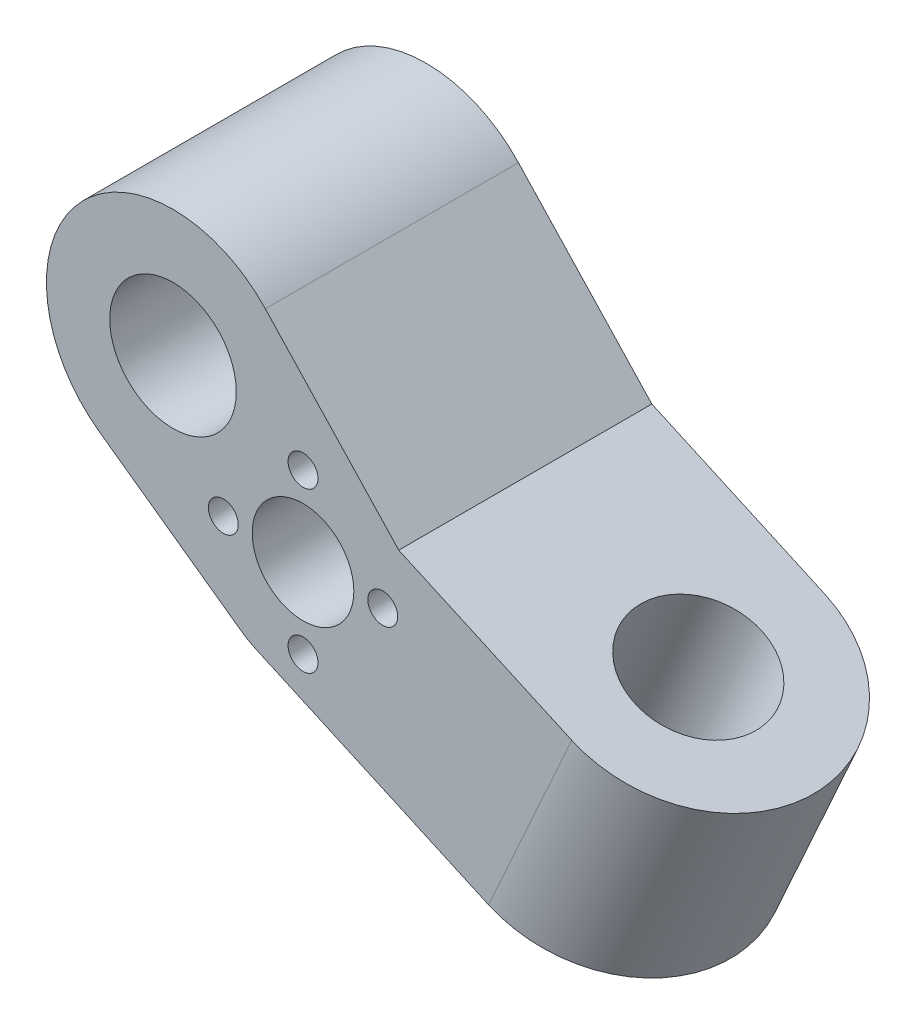
ISO-10303-21;
HEADER;
FILE_DESCRIPTION(('STEP AP214'),'2;1');
FILE_NAME('part.step','',(''),(''),'','','');
FILE_SCHEMA(('AUTOMOTIVE_DESIGN { 1 0 10303 214 1 1 1 1 }'));
ENDSEC;
DATA;
#1=APPLICATION_CONTEXT('core data for automotive mechanical design processes');
#2=APPLICATION_PROTOCOL_DEFINITION('international standard','automotive_design',2000,#1);
#3=PRODUCT_CONTEXT('',#1,'mechanical');
#4=PRODUCT('Part','Part','',(#3));
#5=PRODUCT_RELATED_PRODUCT_CATEGORY('part','',(#4));
#6=PRODUCT_DEFINITION_FORMATION('','',#4);
#7=PRODUCT_DEFINITION_CONTEXT('part definition',#1,'design');
#8=PRODUCT_DEFINITION('design','',#6,#7);
#9=PRODUCT_DEFINITION_SHAPE('','',#8);
#10=(LENGTH_UNIT() NAMED_UNIT(*) SI_UNIT(.MILLI.,.METRE.));
#11=(NAMED_UNIT(*) PLANE_ANGLE_UNIT() SI_UNIT($,.RADIAN.));
#12=(NAMED_UNIT(*) SI_UNIT($,.STERADIAN.) SOLID_ANGLE_UNIT());
#13=UNCERTAINTY_MEASURE_WITH_UNIT(LENGTH_MEASURE(1.E-05),#10,'distance_accuracy_value','');
#14=(GEOMETRIC_REPRESENTATION_CONTEXT(3) GLOBAL_UNCERTAINTY_ASSIGNED_CONTEXT((#13)) GLOBAL_UNIT_ASSIGNED_CONTEXT((#10,
#11,#12)) REPRESENTATION_CONTEXT('',''));
#15=CARTESIAN_POINT('',(0.,0.,0.));
#16=DIRECTION('',(0.,0.,1.));
#17=DIRECTION('',(1.,0.,0.));
#18=AXIS2_PLACEMENT_3D('',#15,#16,#17);
#19=CARTESIAN_POINT('',(-55.498309581815,-77.4958825390944,25.4));
#20=DIRECTION('',(0.582238843982918,0.813017791046073,0.));
#21=DIRECTION('',(-0.813017791046073,0.582238843982918,0.));
#22=AXIS2_PLACEMENT_3D('',#19,#20,#21);
#23=PLANE('',#22);
#24=DIRECTION('',(0.813017791046073,-0.582238843982918,0.));
#25=VECTOR('',#24,1.);
#26=CARTESIAN_POINT('',(-55.498309581815,-77.4958825390944,0.));
#27=LINE('',#26,#25);
#28=CARTESIAN_POINT('',(-95.4426102206748,-48.8899606468416,0.));
#29=VERTEX_POINT('',#28);
#30=CARTESIAN_POINT('',(-81.4046272838121,-58.9431957015068,0.));
#31=VERTEX_POINT('',#30);
#32=EDGE_CURVE('E187',#29,#31,#27,.T.);
#33=ORIENTED_EDGE('',*,*,#32,.T.);
#34=DIRECTION('',(0.,0.,-1.));
#35=VECTOR('',#34,1.);
#36=CARTESIAN_POINT('',(-81.4046272838121,-58.9431957015068,25.4));
#37=LINE('',#36,#35);
#38=CARTESIAN_POINT('',(-81.4046272838121,-58.9431957015068,25.4));
#39=VERTEX_POINT('',#38);
#40=EDGE_CURVE('E12',#39,#31,#37,.T.);
#41=ORIENTED_EDGE('',*,*,#40,.F.);
#42=DIRECTION('',(0.813017791046073,-0.582238843982918,0.));
#43=VECTOR('',#42,1.);
#44=CARTESIAN_POINT('',(-55.498309581815,-77.4958825390944,25.4));
#45=LINE('',#44,#43);
#46=CARTESIAN_POINT('',(-95.4426102206748,-48.8899606468416,25.4));
#47=VERTEX_POINT('',#46);
#48=EDGE_CURVE('E218',#47,#39,#45,.T.);
#49=ORIENTED_EDGE('',*,*,#48,.F.);
#50=DIRECTION('',(0.,0.,-1.));
#51=VECTOR('',#50,1.);
#52=CARTESIAN_POINT('',(-95.4426102206748,-48.8899606468416,25.4));
#53=LINE('',#52,#51);
#54=EDGE_CURVE('E100',#47,#29,#53,.T.);
#55=ORIENTED_EDGE('',*,*,#54,.T.);
#56=EDGE_LOOP('',(#33,#41,#49,#55));
#57=FACE_BOUND('',#56,.T.);
#58=ADVANCED_FACE('F77',(#57),#23,.F.);
#59=CARTESIAN_POINT('',(-75.,-50.,25.4));
#60=DIRECTION('',(0.,0.,-1.));
#61=DIRECTION('',(-1.,0.,0.));
#62=AXIS2_PLACEMENT_3D('',#59,#60,#61);
#63=CYLINDRICAL_SURFACE('',#62,11.);
#64=CARTESIAN_POINT('',(-75.,-50.,0.));
#65=DIRECTION('',(0.,0.,1.));
#66=DIRECTION('',(1.,0.,0.));
#67=AXIS2_PLACEMENT_3D('',#64,#65,#66);
#68=CIRCLE('',#67,11.);
#69=CARTESIAN_POINT('',(-79.5269394944947,-60.0253089136038,0.));
#70=VERTEX_POINT('',#69);
#71=EDGE_CURVE('E189',#31,#70,#68,.T.);
#72=ORIENTED_EDGE('',*,*,#71,.T.);
#73=DIRECTION('',(0.,0.,-1.));
#74=VECTOR('',#73,1.);
#75=CARTESIAN_POINT('',(-79.5269394944947,-60.0253089136038,25.4));
#76=LINE('',#75,#74);
#77=CARTESIAN_POINT('',(-79.5269394944947,-60.0253089136038,25.4));
#78=VERTEX_POINT('',#77);
#79=EDGE_CURVE('E84',#78,#70,#76,.T.);
#80=ORIENTED_EDGE('',*,*,#79,.F.);
#81=CARTESIAN_POINT('',(-75.,-50.,25.4));
#82=DIRECTION('',(0.,0.,1.));
#83=DIRECTION('',(1.,0.,0.));
#84=AXIS2_PLACEMENT_3D('',#81,#82,#83);
#85=CIRCLE('',#84,11.);
#86=EDGE_CURVE('E130',#39,#78,#85,.T.);
#87=ORIENTED_EDGE('',*,*,#86,.F.);
#88=ORIENTED_EDGE('',*,*,#40,.T.);
#89=EDGE_LOOP('',(#72,#80,#87,#88));
#90=FACE_BOUND('',#89,.T.);
#91=ADVANCED_FACE('F226',(#90),#63,.T.);
#92=CARTESIAN_POINT('',(-35.9830298439687,-79.6876101993222,25.4));
#93=DIRECTION('',(-0.411539954044973,-0.911391719418528,0.));
#94=DIRECTION('',(0.911391719418528,-0.411539954044974,0.));
#95=AXIS2_PLACEMENT_3D('',#92,#93,#94);
#96=PLANE('',#95);
#97=CARTESIAN_POINT('',(-56.3775898212641,-70.4784237463461,12.7));
#98=DIRECTION('',(-0.411539954044973,-0.911391719418528,0.));
#99=DIRECTION('',(0.911391719418528,-0.411539954044974,0.));
#100=AXIS2_PLACEMENT_3D('',#97,#98,#99);
#101=CIRCLE('',#100,6.35);
#102=CARTESIAN_POINT('',(-50.5902524029564,-73.0917024545317,12.7));
#103=VERTEX_POINT('',#102);
#104=EDGE_CURVE('E241',#103,#103,#101,.F.);
#105=ORIENTED_EDGE('',*,*,#104,.T.);
#106=EDGE_LOOP('',(#105));
#107=FACE_BOUND('',#106,.T.);
#108=DIRECTION('',(-0.911391719418528,0.411539954044974,0.));
#109=VECTOR('',#108,1.);
#110=CARTESIAN_POINT('',(-35.9830298439687,-79.6876101993222,0.));
#111=LINE('',#110,#109);
#112=CARTESIAN_POINT('',(-56.3775898212641,-70.4784237463461,0.));
#113=VERTEX_POINT('',#112);
#114=EDGE_CURVE('E192',#113,#70,#111,.T.);
#115=ORIENTED_EDGE('',*,*,#114,.F.);
#116=CARTESIAN_POINT('',(-56.3775898212641,-70.4784237463461,12.7));
#117=DIRECTION('',(-0.411539954044973,-0.911391719418528,0.));
#118=DIRECTION('',(0.911391719418528,-0.411539954044974,0.));
#119=AXIS2_PLACEMENT_3D('',#116,#117,#118);
#120=CIRCLE('',#119,12.7);
#121=CARTESIAN_POINT('',(-56.3775898212641,-70.4784237463461,25.4));
#122=VERTEX_POINT('',#121);
#123=EDGE_CURVE('E238',#113,#122,#120,.T.);
#124=ORIENTED_EDGE('',*,*,#123,.T.);
#125=DIRECTION('',(-0.911391719418528,0.411539954044974,0.));
#126=VECTOR('',#125,1.);
#127=CARTESIAN_POINT('',(-35.9830298439687,-79.6876101993222,25.4));
#128=LINE('',#127,#126);
#129=EDGE_CURVE('E163',#122,#78,#128,.T.);
#130=ORIENTED_EDGE('',*,*,#129,.T.);
#131=ORIENTED_EDGE('',*,*,#79,.T.);
#132=EDGE_LOOP('',(#115,#124,#130,#131));
#133=FACE_BOUND('',#132,.T.);
#134=ADVANCED_FACE('F223',(#107,#133),#96,.T.);
#135=CARTESIAN_POINT('',(-27.6395674308052,-61.2102728718123,25.4));
#136=DIRECTION('',(0.411539954044974,0.911391719418528,0.));
#137=DIRECTION('',(-0.911391719418528,0.411539954044974,0.));
#138=AXIS2_PLACEMENT_3D('',#135,#136,#137);
#139=PLANE('',#138);
#140=CARTESIAN_POINT('',(-48.0341274081007,-52.0010864188363,12.7));
#141=DIRECTION('',(0.411539954044974,0.911391719418528,0.));
#142=DIRECTION('',(-0.911391719418528,0.411539954044974,0.));
#143=AXIS2_PLACEMENT_3D('',#140,#141,#142);
#144=CIRCLE('',#143,6.35);
#145=CARTESIAN_POINT('',(-53.8214648264083,-49.3878077106507,12.7));
#146=VERTEX_POINT('',#145);
#147=EDGE_CURVE('E236',#146,#146,#144,.T.);
#148=ORIENTED_EDGE('',*,*,#147,.F.);
#149=EDGE_LOOP('',(#148));
#150=FACE_BOUND('',#149,.T.);
#151=CARTESIAN_POINT('',(-48.0341274081007,-52.0010864188363,12.7));
#152=DIRECTION('',(0.411539954044974,0.911391719418528,0.));
#153=DIRECTION('',(-0.911391719418528,0.411539954044974,0.));
#154=AXIS2_PLACEMENT_3D('',#151,#152,#153);
#155=CIRCLE('',#154,12.7);
#156=CARTESIAN_POINT('',(-48.0341274081007,-52.0010864188363,0.));
#157=VERTEX_POINT('',#156);
#158=CARTESIAN_POINT('',(-48.0341274081006,-52.0010864188362,25.4));
#159=VERTEX_POINT('',#158);
#160=EDGE_CURVE('E91',#157,#159,#155,.F.);
#161=ORIENTED_EDGE('',*,*,#160,.F.);
#162=DIRECTION('',(0.911391719418528,-0.411539954044974,0.));
#163=VECTOR('',#162,1.);
#164=CARTESIAN_POINT('',(-27.6395674308052,-61.2102728718123,0.));
#165=LINE('',#164,#163);
#166=CARTESIAN_POINT('',(-65.3961396630236,-44.1612502942795,0.));
#167=VERTEX_POINT('',#166);
#168=EDGE_CURVE('E146',#167,#157,#165,.T.);
#169=ORIENTED_EDGE('',*,*,#168,.F.);
#170=DIRECTION('',(0.,0.,-1.));
#171=VECTOR('',#170,1.);
#172=CARTESIAN_POINT('',(-65.3961396630236,-44.1612502942795,25.4));
#173=LINE('',#172,#171);
#174=CARTESIAN_POINT('',(-65.3961396630236,-44.1612502942795,25.4));
#175=VERTEX_POINT('',#174);
#176=EDGE_CURVE('E140',#175,#167,#173,.T.);
#177=ORIENTED_EDGE('',*,*,#176,.F.);
#178=DIRECTION('',(0.911391719418528,-0.411539954044974,0.));
#179=VECTOR('',#178,1.);
#180=CARTESIAN_POINT('',(-27.6395674308052,-61.2102728718123,25.4));
#181=LINE('',#180,#179);
#182=EDGE_CURVE('E144',#175,#159,#181,.T.);
#183=ORIENTED_EDGE('',*,*,#182,.T.);
#184=EDGE_LOOP('',(#161,#169,#177,#183));
#185=FACE_BOUND('',#184,.T.);
#186=ADVANCED_FACE('F142',(#150,#185),#139,.T.);
#187=CARTESIAN_POINT('',(-56.8473280884351,-53.2820851007276,25.4));
#188=DIRECTION('',(-0.729615872168891,-0.683857206644215,0.));
#189=DIRECTION('',(0.683857206644215,-0.729615872168891,0.));
#190=AXIS2_PLACEMENT_3D('',#187,#188,#189);
#191=PLANE('',#190);
#192=DIRECTION('',(-0.683857206644215,0.729615872168891,0.));
#193=VECTOR('',#192,1.);
#194=CARTESIAN_POINT('',(-56.8473280884351,-53.2820851007276,0.));
#195=LINE('',#194,#193);
#196=CARTESIAN_POINT('',(-78.7820553255468,-29.8796481761749,0.));
#197=VERTEX_POINT('',#196);
#198=EDGE_CURVE('E195',#167,#197,#195,.T.);
#199=ORIENTED_EDGE('',*,*,#198,.T.);
#200=DIRECTION('',(0.,0.,-1.));
#201=VECTOR('',#200,1.);
#202=CARTESIAN_POINT('',(-78.7820553255468,-29.8796481761749,25.4));
#203=LINE('',#202,#201);
#204=CARTESIAN_POINT('',(-78.7820553255468,-29.8796481761749,25.4));
#205=VERTEX_POINT('',#204);
#206=EDGE_CURVE('E150',#205,#197,#203,.T.);
#207=ORIENTED_EDGE('',*,*,#206,.F.);
#208=DIRECTION('',(-0.683857206644215,0.729615872168891,0.));
#209=VECTOR('',#208,1.);
#210=CARTESIAN_POINT('',(-56.8473280884351,-53.2820851007276,25.4));
#211=LINE('',#210,#209);
#212=EDGE_CURVE('E153',#175,#205,#211,.T.);
#213=ORIENTED_EDGE('',*,*,#212,.F.);
#214=ORIENTED_EDGE('',*,*,#176,.T.);
#215=EDGE_LOOP('',(#199,#207,#213,#214));
#216=FACE_BOUND('',#215,.T.);
#217=ADVANCED_FACE('F154',(#216),#191,.F.);
#218=CARTESIAN_POINT('',(-75.,-58.,25.4));
#219=DIRECTION('',(0.,0.,-1.));
#220=DIRECTION('',(-1.,0.,0.));
#221=AXIS2_PLACEMENT_3D('',#218,#219,#220);
#222=CYLINDRICAL_SURFACE('',#221,1.5);
#223=CARTESIAN_POINT('',(-75.,-58.,25.4));
#224=DIRECTION('',(0.,0.,1.));
#225=DIRECTION('',(1.,0.,0.));
#226=AXIS2_PLACEMENT_3D('',#223,#224,#225);
#227=CIRCLE('',#226,1.5);
#228=CARTESIAN_POINT('',(-73.5,-58.,25.4));
#229=VERTEX_POINT('',#228);
#230=EDGE_CURVE('E181',#229,#229,#227,.T.);
#231=ORIENTED_EDGE('',*,*,#230,.T.);
#232=EDGE_LOOP('',(#231));
#233=FACE_BOUND('',#232,.T.);
#234=CARTESIAN_POINT('',(-75.,-58.,0.));
#235=DIRECTION('',(0.,0.,1.));
#236=DIRECTION('',(1.,0.,0.));
#237=AXIS2_PLACEMENT_3D('',#234,#235,#236);
#238=CIRCLE('',#237,1.5);
#239=CARTESIAN_POINT('',(-73.5,-58.,0.));
#240=VERTEX_POINT('',#239);
#241=EDGE_CURVE('E212',#240,#240,#238,.T.);
#242=ORIENTED_EDGE('',*,*,#241,.F.);
#243=EDGE_LOOP('',(#242));
#244=FACE_BOUND('',#243,.T.);
#245=ADVANCED_FACE('F262',(#233,#244),#222,.F.);
#246=CARTESIAN_POINT('',(-83.,-50.,25.4));
#247=DIRECTION('',(0.,0.,-1.));
#248=DIRECTION('',(-1.,0.,0.));
#249=AXIS2_PLACEMENT_3D('',#246,#247,#248);
#250=CYLINDRICAL_SURFACE('',#249,1.5);
#251=CARTESIAN_POINT('',(-83.,-50.,25.4));
#252=DIRECTION('',(0.,0.,1.));
#253=DIRECTION('',(1.,0.,0.));
#254=AXIS2_PLACEMENT_3D('',#251,#252,#253);
#255=CIRCLE('',#254,1.5);
#256=CARTESIAN_POINT('',(-81.5,-50.,25.4));
#257=VERTEX_POINT('',#256);
#258=EDGE_CURVE('E178',#257,#257,#255,.T.);
#259=ORIENTED_EDGE('',*,*,#258,.T.);
#260=EDGE_LOOP('',(#259));
#261=FACE_BOUND('',#260,.T.);
#262=CARTESIAN_POINT('',(-83.,-50.,0.));
#263=DIRECTION('',(0.,0.,1.));
#264=DIRECTION('',(1.,0.,0.));
#265=AXIS2_PLACEMENT_3D('',#262,#263,#264);
#266=CIRCLE('',#265,1.5);
#267=CARTESIAN_POINT('',(-81.5,-50.,0.));
#268=VERTEX_POINT('',#267);
#269=EDGE_CURVE('E209',#268,#268,#266,.T.);
#270=ORIENTED_EDGE('',*,*,#269,.F.);
#271=EDGE_LOOP('',(#270));
#272=FACE_BOUND('',#271,.T.);
#273=ADVANCED_FACE('F278',(#261,#272),#250,.F.);
#274=CARTESIAN_POINT('',(-67.,-50.,25.4));
#275=DIRECTION('',(0.,0.,-1.));
#276=DIRECTION('',(-1.,0.,0.));
#277=AXIS2_PLACEMENT_3D('',#274,#275,#276);
#278=CYLINDRICAL_SURFACE('',#277,1.5);
#279=CARTESIAN_POINT('',(-67.,-50.,25.4));
#280=DIRECTION('',(0.,0.,1.));
#281=DIRECTION('',(1.,0.,0.));
#282=AXIS2_PLACEMENT_3D('',#279,#280,#281);
#283=CIRCLE('',#282,1.5);
#284=CARTESIAN_POINT('',(-65.5,-50.,25.4));
#285=VERTEX_POINT('',#284);
#286=EDGE_CURVE('E175',#285,#285,#283,.T.);
#287=ORIENTED_EDGE('',*,*,#286,.T.);
#288=EDGE_LOOP('',(#287));
#289=FACE_BOUND('',#288,.T.);
#290=CARTESIAN_POINT('',(-67.,-50.,0.));
#291=DIRECTION('',(0.,0.,1.));
#292=DIRECTION('',(1.,0.,0.));
#293=AXIS2_PLACEMENT_3D('',#290,#291,#292);
#294=CIRCLE('',#293,1.5);
#295=CARTESIAN_POINT('',(-65.5,-50.,0.));
#296=VERTEX_POINT('',#295);
#297=EDGE_CURVE('E206',#296,#296,#294,.T.);
#298=ORIENTED_EDGE('',*,*,#297,.F.);
#299=EDGE_LOOP('',(#298));
#300=FACE_BOUND('',#299,.T.);
#301=ADVANCED_FACE('F274',(#289,#300),#278,.F.);
#302=CARTESIAN_POINT('',(-75.,-42.,25.4));
#303=DIRECTION('',(0.,0.,-1.));
#304=DIRECTION('',(-1.,0.,0.));
#305=AXIS2_PLACEMENT_3D('',#302,#303,#304);
#306=CYLINDRICAL_SURFACE('',#305,1.5);
#307=CARTESIAN_POINT('',(-75.,-42.,25.4));
#308=DIRECTION('',(0.,0.,1.));
#309=DIRECTION('',(1.,0.,0.));
#310=AXIS2_PLACEMENT_3D('',#307,#308,#309);
#311=CIRCLE('',#310,1.5);
#312=CARTESIAN_POINT('',(-73.5,-42.,25.4));
#313=VERTEX_POINT('',#312);
#314=EDGE_CURVE('E172',#313,#313,#311,.T.);
#315=ORIENTED_EDGE('',*,*,#314,.T.);
#316=EDGE_LOOP('',(#315));
#317=FACE_BOUND('',#316,.T.);
#318=CARTESIAN_POINT('',(-75.,-42.,0.));
#319=DIRECTION('',(0.,0.,1.));
#320=DIRECTION('',(1.,0.,0.));
#321=AXIS2_PLACEMENT_3D('',#318,#319,#320);
#322=CIRCLE('',#321,1.5);
#323=CARTESIAN_POINT('',(-73.5,-42.,0.));
#324=VERTEX_POINT('',#323);
#325=EDGE_CURVE('E203',#324,#324,#322,.T.);
#326=ORIENTED_EDGE('',*,*,#325,.F.);
#327=EDGE_LOOP('',(#326));
#328=FACE_BOUND('',#327,.T.);
#329=ADVANCED_FACE('F270',(#317,#328),#306,.F.);
#330=CARTESIAN_POINT('',(-75.,-50.,25.4));
#331=DIRECTION('',(0.,0.,-1.));
#332=DIRECTION('',(-1.,0.,0.));
#333=AXIS2_PLACEMENT_3D('',#330,#331,#332);
#334=CYLINDRICAL_SURFACE('',#333,5.1);
#335=CARTESIAN_POINT('',(-75.,-50.,25.4));
#336=DIRECTION('',(0.,0.,1.));
#337=DIRECTION('',(1.,0.,0.));
#338=AXIS2_PLACEMENT_3D('',#335,#336,#337);
#339=CIRCLE('',#338,5.1);
#340=CARTESIAN_POINT('',(-69.9,-50.,25.4));
#341=VERTEX_POINT('',#340);
#342=EDGE_CURVE('E169',#341,#341,#339,.T.);
#343=ORIENTED_EDGE('',*,*,#342,.T.);
#344=EDGE_LOOP('',(#343));
#345=FACE_BOUND('',#344,.T.);
#346=CARTESIAN_POINT('',(-75.,-50.,0.));
#347=DIRECTION('',(0.,0.,1.));
#348=DIRECTION('',(1.,0.,0.));
#349=AXIS2_PLACEMENT_3D('',#346,#347,#348);
#350=CIRCLE('',#349,5.1);
#351=CARTESIAN_POINT('',(-69.9,-50.,0.));
#352=VERTEX_POINT('',#351);
#353=EDGE_CURVE('E200',#352,#352,#350,.T.);
#354=ORIENTED_EDGE('',*,*,#353,.F.);
#355=EDGE_LOOP('',(#354));
#356=FACE_BOUND('',#355,.T.);
#357=ADVANCED_FACE('F267',(#345,#356),#334,.F.);
#358=CARTESIAN_POINT('',(-88.0481769020917,-38.5646347005565,25.4));
#359=DIRECTION('',(0.,0.,-1.));
#360=DIRECTION('',(-1.,0.,0.));
#361=AXIS2_PLACEMENT_3D('',#358,#359,#360);
#362=CYLINDRICAL_SURFACE('',#361,12.7);
#363=CARTESIAN_POINT('',(-88.0481769020917,-38.5646347005565,0.));
#364=DIRECTION('',(0.,0.,1.));
#365=DIRECTION('',(1.,0.,0.));
#366=AXIS2_PLACEMENT_3D('',#363,#364,#365);
#367=CIRCLE('',#366,12.7);
#368=EDGE_CURVE('E197',#29,#197,#367,.F.);
#369=ORIENTED_EDGE('',*,*,#368,.F.);
#370=ORIENTED_EDGE('',*,*,#54,.F.);
#371=CARTESIAN_POINT('',(-88.0481769020917,-38.5646347005565,25.4));
#372=DIRECTION('',(0.,0.,1.));
#373=DIRECTION('',(1.,0.,0.));
#374=AXIS2_PLACEMENT_3D('',#371,#372,#373);
#375=CIRCLE('',#374,12.7);
#376=EDGE_CURVE('E157',#47,#205,#375,.F.);
#377=ORIENTED_EDGE('',*,*,#376,.T.);
#378=ORIENTED_EDGE('',*,*,#206,.T.);
#379=EDGE_LOOP('',(#369,#370,#377,#378));
#380=FACE_BOUND('',#379,.T.);
#381=ADVANCED_FACE('F263',(#380),#362,.T.);
#382=CARTESIAN_POINT('',(-88.0481769020917,-38.5646347005565,25.4));
#383=DIRECTION('',(0.,0.,-1.));
#384=DIRECTION('',(-1.,0.,0.));
#385=AXIS2_PLACEMENT_3D('',#382,#383,#384);
#386=CYLINDRICAL_SURFACE('',#385,6.34999999999998);
#387=CARTESIAN_POINT('',(-88.0481769020917,-38.5646347005565,25.4));
#388=DIRECTION('',(0.,0.,1.));
#389=DIRECTION('',(1.,0.,0.));
#390=AXIS2_PLACEMENT_3D('',#387,#388,#389);
#391=CIRCLE('',#390,6.34999999999998);
#392=CARTESIAN_POINT('',(-81.6981769020918,-38.5646347005565,25.4));
#393=VERTEX_POINT('',#392);
#394=EDGE_CURVE('E184',#393,#393,#391,.T.);
#395=ORIENTED_EDGE('',*,*,#394,.T.);
#396=EDGE_LOOP('',(#395));
#397=FACE_BOUND('',#396,.T.);
#398=CARTESIAN_POINT('',(-88.0481769020917,-38.5646347005565,0.));
#399=DIRECTION('',(0.,0.,1.));
#400=DIRECTION('',(1.,0.,0.));
#401=AXIS2_PLACEMENT_3D('',#398,#399,#400);
#402=CIRCLE('',#401,6.34999999999998);
#403=CARTESIAN_POINT('',(-81.6981769020918,-38.5646347005565,0.));
#404=VERTEX_POINT('',#403);
#405=EDGE_CURVE('E215',#404,#404,#402,.T.);
#406=ORIENTED_EDGE('',*,*,#405,.F.);
#407=EDGE_LOOP('',(#406));
#408=FACE_BOUND('',#407,.T.);
#409=ADVANCED_FACE('F266',(#397,#408),#386,.F.);
#410=CARTESIAN_POINT('',(0.,0.,25.4));
#411=DIRECTION('',(0.,0.,1.));
#412=DIRECTION('',(1.,0.,0.));
#413=AXIS2_PLACEMENT_3D('',#410,#411,#412);
#414=PLANE('',#413);
#415=DIRECTION('',(0.411539954044974,0.911391719418528,0.));
#416=VECTOR('',#415,1.);
#417=CARTESIAN_POINT('',(-63.7690582040179,-86.8474858803461,25.4));
#418=LINE('',#417,#416);
#419=EDGE_CURVE('E162',#122,#159,#418,.T.);
#420=ORIENTED_EDGE('',*,*,#419,.T.);
#421=ORIENTED_EDGE('',*,*,#182,.F.);
#422=ORIENTED_EDGE('',*,*,#212,.T.);
#423=ORIENTED_EDGE('',*,*,#376,.F.);
#424=ORIENTED_EDGE('',*,*,#48,.T.);
#425=ORIENTED_EDGE('',*,*,#86,.T.);
#426=ORIENTED_EDGE('',*,*,#129,.F.);
#427=EDGE_LOOP('',(#420,#421,#422,#423,#424,#425,#426));
#428=FACE_BOUND('',#427,.T.);
#429=ORIENTED_EDGE('',*,*,#342,.F.);
#430=EDGE_LOOP('',(#429));
#431=FACE_BOUND('',#430,.T.);
#432=ORIENTED_EDGE('',*,*,#314,.F.);
#433=EDGE_LOOP('',(#432));
#434=FACE_BOUND('',#433,.T.);
#435=ORIENTED_EDGE('',*,*,#286,.F.);
#436=EDGE_LOOP('',(#435));
#437=FACE_BOUND('',#436,.T.);
#438=ORIENTED_EDGE('',*,*,#258,.F.);
#439=EDGE_LOOP('',(#438));
#440=FACE_BOUND('',#439,.T.);
#441=ORIENTED_EDGE('',*,*,#230,.F.);
#442=EDGE_LOOP('',(#441));
#443=FACE_BOUND('',#442,.T.);
#444=ORIENTED_EDGE('',*,*,#394,.F.);
#445=EDGE_LOOP('',(#444));
#446=FACE_BOUND('',#445,.T.);
#447=ADVANCED_FACE('F159',(#428,#431,#434,#437,#440,#443,#446),#414,.T.);
#448=CARTESIAN_POINT('',(0.,0.,0.));
#449=DIRECTION('',(0.,0.,1.));
#450=DIRECTION('',(1.,0.,0.));
#451=AXIS2_PLACEMENT_3D('',#448,#449,#450);
#452=PLANE('',#451);
#453=ORIENTED_EDGE('',*,*,#168,.T.);
#454=DIRECTION('',(0.411539954044974,0.911391719418528,0.));
#455=VECTOR('',#454,1.);
#456=CARTESIAN_POINT('',(-63.7690582040179,-86.8474858803461,0.));
#457=LINE('',#456,#455);
#458=EDGE_CURVE('E232',#113,#157,#457,.T.);
#459=ORIENTED_EDGE('',*,*,#458,.F.);
#460=ORIENTED_EDGE('',*,*,#114,.T.);
#461=ORIENTED_EDGE('',*,*,#71,.F.);
#462=ORIENTED_EDGE('',*,*,#32,.F.);
#463=ORIENTED_EDGE('',*,*,#368,.T.);
#464=ORIENTED_EDGE('',*,*,#198,.F.);
#465=EDGE_LOOP('',(#453,#459,#460,#461,#462,#463,#464));
#466=FACE_BOUND('',#465,.T.);
#467=ORIENTED_EDGE('',*,*,#353,.T.);
#468=EDGE_LOOP('',(#467));
#469=FACE_BOUND('',#468,.T.);
#470=ORIENTED_EDGE('',*,*,#325,.T.);
#471=EDGE_LOOP('',(#470));
#472=FACE_BOUND('',#471,.T.);
#473=ORIENTED_EDGE('',*,*,#297,.T.);
#474=EDGE_LOOP('',(#473));
#475=FACE_BOUND('',#474,.T.);
#476=ORIENTED_EDGE('',*,*,#269,.T.);
#477=EDGE_LOOP('',(#476));
#478=FACE_BOUND('',#477,.T.);
#479=ORIENTED_EDGE('',*,*,#241,.T.);
#480=EDGE_LOOP('',(#479));
#481=FACE_BOUND('',#480,.T.);
#482=ORIENTED_EDGE('',*,*,#405,.T.);
#483=EDGE_LOOP('',(#482));
#484=FACE_BOUND('',#483,.T.);
#485=ADVANCED_FACE('F229',(#466,#469,#472,#475,#478,#481,#484),#452,.F.);
#486=CARTESIAN_POINT('',(-63.7690582040179,-86.8474858803461,12.7));
#487=DIRECTION('',(0.411539954044974,0.911391719418528,0.));
#488=DIRECTION('',(-0.911391719418528,0.411539954044974,0.));
#489=AXIS2_PLACEMENT_3D('',#486,#487,#488);
#490=CYLINDRICAL_SURFACE('',#489,12.7);
#491=ORIENTED_EDGE('',*,*,#123,.F.);
#492=ORIENTED_EDGE('',*,*,#458,.T.);
#493=ORIENTED_EDGE('',*,*,#160,.T.);
#494=ORIENTED_EDGE('',*,*,#419,.F.);
#495=EDGE_LOOP('',(#491,#492,#493,#494));
#496=FACE_BOUND('',#495,.T.);
#497=ADVANCED_FACE('F291',(#496),#490,.T.);
#498=CARTESIAN_POINT('',(-63.7690582040179,-86.8474858803461,12.7));
#499=DIRECTION('',(0.411539954044974,0.911391719418528,0.));
#500=DIRECTION('',(-0.911391719418528,0.411539954044974,0.));
#501=AXIS2_PLACEMENT_3D('',#498,#499,#500);
#502=CYLINDRICAL_SURFACE('',#501,6.35);
#503=ORIENTED_EDGE('',*,*,#147,.T.);
#504=EDGE_LOOP('',(#503));
#505=FACE_BOUND('',#504,.T.);
#506=ORIENTED_EDGE('',*,*,#104,.F.);
#507=EDGE_LOOP('',(#506));
#508=FACE_BOUND('',#507,.T.);
#509=ADVANCED_FACE('F296',(#505,#508),#502,.F.);
#510=CLOSED_SHELL('',(#58,#91,#134,#186,#217,#245,#273,#301,#329,#357,#381,#409,#447,#485,#497,#509));
#511=MANIFOLD_SOLID_BREP('B2',#510);
#512=ADVANCED_BREP_SHAPE_REPRESENTATION('',(#18,#511),#14);
#513=SHAPE_DEFINITION_REPRESENTATION(#9,#512);
ENDSEC;
END-ISO-10303-21;
